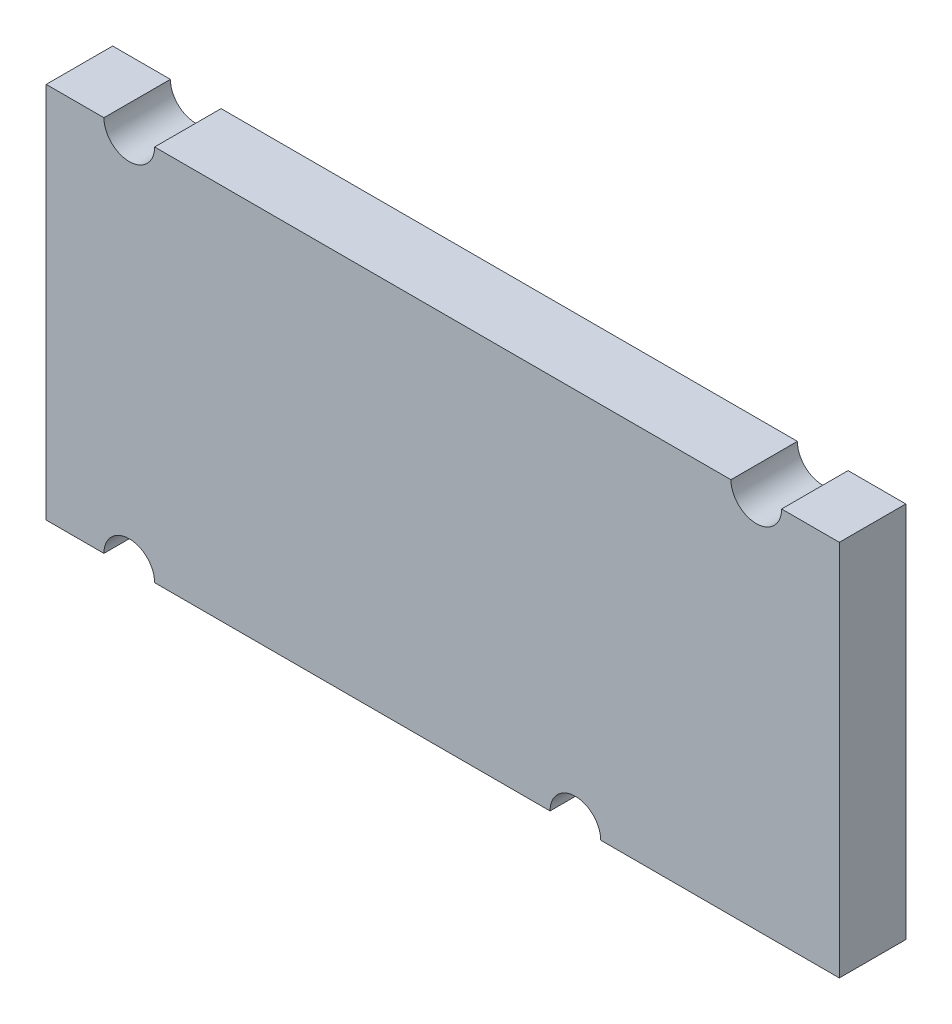
ISO-10303-21;
HEADER;
FILE_DESCRIPTION(('STEP AP214'),'2;1');
FILE_NAME('part.step','',(''),(''),'','','');
FILE_SCHEMA(('AUTOMOTIVE_DESIGN { 1 0 10303 214 1 1 1 1 }'));
ENDSEC;
DATA;
#1=APPLICATION_CONTEXT('core data for automotive mechanical design processes');
#2=APPLICATION_PROTOCOL_DEFINITION('international standard','automotive_design',2000,#1);
#3=PRODUCT_CONTEXT('',#1,'mechanical');
#4=PRODUCT('Part','Part','',(#3));
#5=PRODUCT_RELATED_PRODUCT_CATEGORY('part','',(#4));
#6=PRODUCT_DEFINITION_FORMATION('','',#4);
#7=PRODUCT_DEFINITION_CONTEXT('part definition',#1,'design');
#8=PRODUCT_DEFINITION('design','',#6,#7);
#9=PRODUCT_DEFINITION_SHAPE('','',#8);
#10=(LENGTH_UNIT() NAMED_UNIT(*) SI_UNIT(.MILLI.,.METRE.));
#11=(NAMED_UNIT(*) PLANE_ANGLE_UNIT() SI_UNIT($,.RADIAN.));
#12=(NAMED_UNIT(*) SI_UNIT($,.STERADIAN.) SOLID_ANGLE_UNIT());
#13=UNCERTAINTY_MEASURE_WITH_UNIT(LENGTH_MEASURE(1.E-05),#10,'distance_accuracy_value','');
#14=(GEOMETRIC_REPRESENTATION_CONTEXT(3) GLOBAL_UNCERTAINTY_ASSIGNED_CONTEXT((#13)) GLOBAL_UNIT_ASSIGNED_CONTEXT((#10,
#11,#12)) REPRESENTATION_CONTEXT('',''));
#15=CARTESIAN_POINT('',(0.,0.,0.));
#16=DIRECTION('',(0.,0.,1.));
#17=DIRECTION('',(1.,0.,0.));
#18=AXIS2_PLACEMENT_3D('',#15,#16,#17);
#19=CARTESIAN_POINT('',(11.7352503651986,-11.3549999999781,4.));
#20=DIRECTION('',(0.,0.,-1.));
#21=DIRECTION('',(-1.,0.,0.));
#22=AXIS2_PLACEMENT_3D('',#19,#20,#21);
#23=CYLINDRICAL_SURFACE('',#22,1.52499999999997);
#24=CARTESIAN_POINT('',(11.7352503651986,-11.3549999999781,0.));
#25=DIRECTION('',(0.,0.,1.));
#26=DIRECTION('',(1.,0.,0.));
#27=AXIS2_PLACEMENT_3D('',#24,#25,#26);
#28=CIRCLE('',#27,1.52499999999997);
#29=CARTESIAN_POINT('',(13.2602503651985,-11.3549999999781,0.));
#30=VERTEX_POINT('',#29);
#31=CARTESIAN_POINT('',(10.2102503651986,-11.3549999999781,0.));
#32=VERTEX_POINT('',#31);
#33=EDGE_CURVE('E157',#30,#32,#28,.T.);
#34=ORIENTED_EDGE('',*,*,#33,.F.);
#35=DIRECTION('',(0.,0.,-1.));
#36=VECTOR('',#35,1.);
#37=CARTESIAN_POINT('',(13.2602503651985,-11.3549999999781,4.));
#38=LINE('',#37,#36);
#39=CARTESIAN_POINT('',(13.2602503651985,-11.3549999999781,4.));
#40=VERTEX_POINT('',#39);
#41=EDGE_CURVE('E11',#40,#30,#38,.T.);
#42=ORIENTED_EDGE('',*,*,#41,.F.);
#43=CARTESIAN_POINT('',(11.7352503651986,-11.3549999999781,4.));
#44=DIRECTION('',(0.,0.,1.));
#45=DIRECTION('',(1.,0.,0.));
#46=AXIS2_PLACEMENT_3D('',#43,#44,#45);
#47=CIRCLE('',#46,1.52499999999997);
#48=CARTESIAN_POINT('',(10.2102503651986,-11.3549999999781,4.));
#49=VERTEX_POINT('',#48);
#50=EDGE_CURVE('E223',#40,#49,#47,.T.);
#51=ORIENTED_EDGE('',*,*,#50,.T.);
#52=DIRECTION('',(0.,0.,-1.));
#53=VECTOR('',#52,1.);
#54=CARTESIAN_POINT('',(10.2102503651986,-11.3549999999781,4.));
#55=LINE('',#54,#53);
#56=EDGE_CURVE('E99',#49,#32,#55,.T.);
#57=ORIENTED_EDGE('',*,*,#56,.T.);
#58=EDGE_LOOP('',(#34,#42,#51,#57));
#59=FACE_BOUND('',#58,.T.);
#60=ADVANCED_FACE('F37',(#59),#23,.F.);
#61=CARTESIAN_POINT('',(0.,-11.3549999999781,4.));
#62=DIRECTION('',(0.,1.,0.));
#63=DIRECTION('',(0.,0.,1.));
#64=AXIS2_PLACEMENT_3D('',#61,#62,#63);
#65=PLANE('',#64);
#66=DIRECTION('',(1.,0.,0.));
#67=VECTOR('',#66,1.);
#68=CARTESIAN_POINT('',(0.,-11.3549999999781,0.));
#69=LINE('',#68,#67);
#70=CARTESIAN_POINT('',(27.6218503651986,-11.3549999999781,0.));
#71=VERTEX_POINT('',#70);
#72=EDGE_CURVE('E160',#30,#71,#69,.T.);
#73=ORIENTED_EDGE('',*,*,#72,.T.);
#74=DIRECTION('',(0.,0.,-1.));
#75=VECTOR('',#74,1.);
#76=CARTESIAN_POINT('',(27.6218503651986,-11.3549999999781,4.));
#77=LINE('',#76,#75);
#78=CARTESIAN_POINT('',(27.6218503651986,-11.3549999999781,4.));
#79=VERTEX_POINT('',#78);
#80=EDGE_CURVE('E45',#79,#71,#77,.T.);
#81=ORIENTED_EDGE('',*,*,#80,.F.);
#82=DIRECTION('',(1.,0.,0.));
#83=VECTOR('',#82,1.);
#84=CARTESIAN_POINT('',(0.,-11.3549999999781,4.));
#85=LINE('',#84,#83);
#86=EDGE_CURVE('E141',#40,#79,#85,.T.);
#87=ORIENTED_EDGE('',*,*,#86,.F.);
#88=ORIENTED_EDGE('',*,*,#41,.T.);
#89=EDGE_LOOP('',(#73,#81,#87,#88));
#90=FACE_BOUND('',#89,.T.);
#91=ADVANCED_FACE('F205',(#90),#65,.F.);
#92=CARTESIAN_POINT('',(27.6218503651986,0.,4.));
#93=DIRECTION('',(1.,0.,0.));
#94=DIRECTION('',(0.,1.,0.));
#95=AXIS2_PLACEMENT_3D('',#92,#93,#94);
#96=PLANE('',#95);
#97=DIRECTION('',(0.,-1.,0.));
#98=VECTOR('',#97,1.);
#99=CARTESIAN_POINT('',(27.6218503651986,0.,0.));
#100=LINE('',#99,#98);
#101=CARTESIAN_POINT('',(27.6218503651986,11.3550000000219,0.));
#102=VERTEX_POINT('',#101);
#103=EDGE_CURVE('E163',#102,#71,#100,.T.);
#104=ORIENTED_EDGE('',*,*,#103,.F.);
#105=DIRECTION('',(0.,0.,-1.));
#106=VECTOR('',#105,1.);
#107=CARTESIAN_POINT('',(27.6218503651986,11.3550000000219,4.));
#108=LINE('',#107,#106);
#109=CARTESIAN_POINT('',(27.6218503651986,11.3550000000219,4.));
#110=VERTEX_POINT('',#109);
#111=EDGE_CURVE('E195',#110,#102,#108,.T.);
#112=ORIENTED_EDGE('',*,*,#111,.F.);
#113=DIRECTION('',(0.,-1.,0.));
#114=VECTOR('',#113,1.);
#115=CARTESIAN_POINT('',(27.6218503651986,0.,4.));
#116=LINE('',#115,#114);
#117=EDGE_CURVE('E202',#110,#79,#116,.T.);
#118=ORIENTED_EDGE('',*,*,#117,.T.);
#119=ORIENTED_EDGE('',*,*,#80,.T.);
#120=EDGE_LOOP('',(#104,#112,#118,#119));
#121=FACE_BOUND('',#120,.T.);
#122=ADVANCED_FACE('F200',(#121),#96,.T.);
#123=CARTESIAN_POINT('',(0.,11.3550000000219,4.));
#124=DIRECTION('',(0.,1.,0.));
#125=DIRECTION('',(0.,0.,1.));
#126=AXIS2_PLACEMENT_3D('',#123,#124,#125);
#127=PLANE('',#126);
#128=DIRECTION('',(1.,0.,0.));
#129=VECTOR('',#128,1.);
#130=CARTESIAN_POINT('',(0.,11.3550000000219,0.));
#131=LINE('',#130,#129);
#132=CARTESIAN_POINT('',(24.1468503651986,11.3550000000219,0.));
#133=VERTEX_POINT('',#132);
#134=EDGE_CURVE('E167',#133,#102,#131,.T.);
#135=ORIENTED_EDGE('',*,*,#134,.F.);
#136=DIRECTION('',(0.,0.,-1.));
#137=VECTOR('',#136,1.);
#138=CARTESIAN_POINT('',(24.1468503651986,11.3550000000219,4.));
#139=LINE('',#138,#137);
#140=CARTESIAN_POINT('',(24.1468503651986,11.3550000000219,4.));
#141=VERTEX_POINT('',#140);
#142=EDGE_CURVE('E193',#141,#133,#139,.T.);
#143=ORIENTED_EDGE('',*,*,#142,.F.);
#144=DIRECTION('',(1.,0.,0.));
#145=VECTOR('',#144,1.);
#146=CARTESIAN_POINT('',(0.,11.3550000000219,4.));
#147=LINE('',#146,#145);
#148=EDGE_CURVE('E215',#141,#110,#147,.T.);
#149=ORIENTED_EDGE('',*,*,#148,.T.);
#150=ORIENTED_EDGE('',*,*,#111,.T.);
#151=EDGE_LOOP('',(#135,#143,#149,#150));
#152=FACE_BOUND('',#151,.T.);
#153=ADVANCED_FACE('F212',(#152),#127,.T.);
#154=CARTESIAN_POINT('',(22.6218503651986,11.3550000000219,4.));
#155=DIRECTION('',(0.,0.,-1.));
#156=DIRECTION('',(-1.,0.,0.));
#157=AXIS2_PLACEMENT_3D('',#154,#155,#156);
#158=CYLINDRICAL_SURFACE('',#157,1.52499999999997);
#159=CARTESIAN_POINT('',(22.6218503651986,11.3550000000219,0.));
#160=DIRECTION('',(0.,0.,1.));
#161=DIRECTION('',(1.,0.,0.));
#162=AXIS2_PLACEMENT_3D('',#159,#160,#161);
#163=CIRCLE('',#162,1.52499999999997);
#164=CARTESIAN_POINT('',(21.0968503651986,11.3550000000219,0.));
#165=VERTEX_POINT('',#164);
#166=EDGE_CURVE('E170',#165,#133,#163,.T.);
#167=ORIENTED_EDGE('',*,*,#166,.F.);
#168=DIRECTION('',(0.,0.,-1.));
#169=VECTOR('',#168,1.);
#170=CARTESIAN_POINT('',(21.0968503651986,11.3550000000219,4.));
#171=LINE('',#170,#169);
#172=CARTESIAN_POINT('',(21.0968503651986,11.3550000000219,4.));
#173=VERTEX_POINT('',#172);
#174=EDGE_CURVE('E191',#173,#165,#171,.T.);
#175=ORIENTED_EDGE('',*,*,#174,.F.);
#176=CARTESIAN_POINT('',(22.6218503651986,11.3550000000219,4.));
#177=DIRECTION('',(0.,0.,1.));
#178=DIRECTION('',(1.,0.,0.));
#179=AXIS2_PLACEMENT_3D('',#176,#177,#178);
#180=CIRCLE('',#179,1.52499999999997);
#181=EDGE_CURVE('E219',#173,#141,#180,.T.);
#182=ORIENTED_EDGE('',*,*,#181,.T.);
#183=ORIENTED_EDGE('',*,*,#142,.T.);
#184=EDGE_LOOP('',(#167,#175,#182,#183));
#185=FACE_BOUND('',#184,.T.);
#186=ADVANCED_FACE('F237',(#185),#158,.F.);
#187=CARTESIAN_POINT('',(-13.5897496348014,11.3550000000219,0.));
#188=VERTEX_POINT('',#187);
#189=EDGE_CURVE('E172',#188,#165,#131,.T.);
#190=ORIENTED_EDGE('',*,*,#189,.F.);
#191=DIRECTION('',(0.,0.,-1.));
#192=VECTOR('',#191,1.);
#193=CARTESIAN_POINT('',(-13.5897496348014,11.3550000000219,4.));
#194=LINE('',#193,#192);
#195=CARTESIAN_POINT('',(-13.5897496348014,11.3550000000219,4.));
#196=VERTEX_POINT('',#195);
#197=EDGE_CURVE('E189',#196,#188,#194,.T.);
#198=ORIENTED_EDGE('',*,*,#197,.F.);
#199=EDGE_CURVE('E222',#196,#173,#147,.T.);
#200=ORIENTED_EDGE('',*,*,#199,.T.);
#201=ORIENTED_EDGE('',*,*,#174,.T.);
#202=EDGE_LOOP('',(#190,#198,#200,#201));
#203=FACE_BOUND('',#202,.T.);
#204=ADVANCED_FACE('F235',(#203),#127,.T.);
#205=CARTESIAN_POINT('',(-15.1147496348014,11.3550000000219,4.));
#206=DIRECTION('',(0.,0.,-1.));
#207=DIRECTION('',(-1.,0.,0.));
#208=AXIS2_PLACEMENT_3D('',#205,#206,#207);
#209=CYLINDRICAL_SURFACE('',#208,1.52499999999997);
#210=CARTESIAN_POINT('',(-15.1147496348014,11.3550000000219,0.));
#211=DIRECTION('',(0.,0.,1.));
#212=DIRECTION('',(1.,0.,0.));
#213=AXIS2_PLACEMENT_3D('',#210,#211,#212);
#214=CIRCLE('',#213,1.52499999999997);
#215=CARTESIAN_POINT('',(-16.6397496348014,11.3550000000219,0.));
#216=VERTEX_POINT('',#215);
#217=EDGE_CURVE('E175',#216,#188,#214,.T.);
#218=ORIENTED_EDGE('',*,*,#217,.F.);
#219=DIRECTION('',(0.,0.,-1.));
#220=VECTOR('',#219,1.);
#221=CARTESIAN_POINT('',(-16.6397496348014,11.3550000000219,4.));
#222=LINE('',#221,#220);
#223=CARTESIAN_POINT('',(-16.6397496348014,11.3550000000219,4.));
#224=VERTEX_POINT('',#223);
#225=EDGE_CURVE('E187',#224,#216,#222,.T.);
#226=ORIENTED_EDGE('',*,*,#225,.F.);
#227=CARTESIAN_POINT('',(-15.1147496348014,11.3550000000219,4.));
#228=DIRECTION('',(0.,0.,1.));
#229=DIRECTION('',(1.,0.,0.));
#230=AXIS2_PLACEMENT_3D('',#227,#228,#229);
#231=CIRCLE('',#230,1.52499999999997);
#232=EDGE_CURVE('E226',#224,#196,#231,.T.);
#233=ORIENTED_EDGE('',*,*,#232,.T.);
#234=ORIENTED_EDGE('',*,*,#197,.T.);
#235=EDGE_LOOP('',(#218,#226,#233,#234));
#236=FACE_BOUND('',#235,.T.);
#237=ADVANCED_FACE('F244',(#236),#209,.F.);
#238=CARTESIAN_POINT('',(-20.1147496348014,11.3550000000219,0.));
#239=VERTEX_POINT('',#238);
#240=EDGE_CURVE('E171',#239,#216,#131,.T.);
#241=ORIENTED_EDGE('',*,*,#240,.F.);
#242=DIRECTION('',(0.,0.,-1.));
#243=VECTOR('',#242,1.);
#244=CARTESIAN_POINT('',(-20.1147496348014,11.3550000000219,4.));
#245=LINE('',#244,#243);
#246=CARTESIAN_POINT('',(-20.1147496348014,11.3550000000219,4.));
#247=VERTEX_POINT('',#246);
#248=EDGE_CURVE('E185',#247,#239,#245,.T.);
#249=ORIENTED_EDGE('',*,*,#248,.F.);
#250=EDGE_CURVE('E221',#247,#224,#147,.T.);
#251=ORIENTED_EDGE('',*,*,#250,.T.);
#252=ORIENTED_EDGE('',*,*,#225,.T.);
#253=EDGE_LOOP('',(#241,#249,#251,#252));
#254=FACE_BOUND('',#253,.T.);
#255=ADVANCED_FACE('F243',(#254),#127,.T.);
#256=CARTESIAN_POINT('',(-20.1147496348014,0.,4.));
#257=DIRECTION('',(1.,0.,0.));
#258=DIRECTION('',(0.,1.,0.));
#259=AXIS2_PLACEMENT_3D('',#256,#257,#258);
#260=PLANE('',#259);
#261=DIRECTION('',(0.,-1.,0.));
#262=VECTOR('',#261,1.);
#263=CARTESIAN_POINT('',(-20.1147496348014,0.,0.));
#264=LINE('',#263,#262);
#265=CARTESIAN_POINT('',(-20.1147496348014,-11.3549999999781,0.));
#266=VERTEX_POINT('',#265);
#267=EDGE_CURVE('E178',#239,#266,#264,.T.);
#268=ORIENTED_EDGE('',*,*,#267,.T.);
#269=DIRECTION('',(0.,0.,-1.));
#270=VECTOR('',#269,1.);
#271=CARTESIAN_POINT('',(-20.1147496348014,-11.3549999999781,4.));
#272=LINE('',#271,#270);
#273=CARTESIAN_POINT('',(-20.1147496348014,-11.3549999999781,4.));
#274=VERTEX_POINT('',#273);
#275=EDGE_CURVE('E150',#274,#266,#272,.T.);
#276=ORIENTED_EDGE('',*,*,#275,.F.);
#277=DIRECTION('',(0.,-1.,0.));
#278=VECTOR('',#277,1.);
#279=CARTESIAN_POINT('',(-20.1147496348014,0.,4.));
#280=LINE('',#279,#278);
#281=EDGE_CURVE('E136',#247,#274,#280,.T.);
#282=ORIENTED_EDGE('',*,*,#281,.F.);
#283=ORIENTED_EDGE('',*,*,#248,.T.);
#284=EDGE_LOOP('',(#268,#276,#282,#283));
#285=FACE_BOUND('',#284,.T.);
#286=ADVANCED_FACE('F251',(#285),#260,.F.);
#287=CARTESIAN_POINT('',(-16.6397496348014,-11.3549999999781,0.));
#288=VERTEX_POINT('',#287);
#289=EDGE_CURVE('E146',#266,#288,#69,.T.);
#290=ORIENTED_EDGE('',*,*,#289,.T.);
#291=DIRECTION('',(0.,0.,-1.));
#292=VECTOR('',#291,1.);
#293=CARTESIAN_POINT('',(-16.6397496348014,-11.3549999999781,4.));
#294=LINE('',#293,#292);
#295=CARTESIAN_POINT('',(-16.6397496348014,-11.3549999999781,4.));
#296=VERTEX_POINT('',#295);
#297=EDGE_CURVE('E143',#296,#288,#294,.T.);
#298=ORIENTED_EDGE('',*,*,#297,.F.);
#299=EDGE_CURVE('E129',#274,#296,#85,.T.);
#300=ORIENTED_EDGE('',*,*,#299,.F.);
#301=ORIENTED_EDGE('',*,*,#275,.T.);
#302=EDGE_LOOP('',(#290,#298,#300,#301));
#303=FACE_BOUND('',#302,.T.);
#304=ADVANCED_FACE('F144',(#303),#65,.F.);
#305=CARTESIAN_POINT('',(-15.1147496348014,-11.3549999999781,4.));
#306=DIRECTION('',(0.,0.,-1.));
#307=DIRECTION('',(-1.,0.,0.));
#308=AXIS2_PLACEMENT_3D('',#305,#306,#307);
#309=CYLINDRICAL_SURFACE('',#308,1.52499999999997);
#310=CARTESIAN_POINT('',(-15.1147496348014,-11.3549999999781,0.));
#311=DIRECTION('',(0.,0.,1.));
#312=DIRECTION('',(1.,0.,0.));
#313=AXIS2_PLACEMENT_3D('',#310,#311,#312);
#314=CIRCLE('',#313,1.52499999999997);
#315=CARTESIAN_POINT('',(-13.5897496348014,-11.3549999999781,0.));
#316=VERTEX_POINT('',#315);
#317=EDGE_CURVE('E180',#316,#288,#314,.T.);
#318=ORIENTED_EDGE('',*,*,#317,.F.);
#319=DIRECTION('',(0.,0.,-1.));
#320=VECTOR('',#319,1.);
#321=CARTESIAN_POINT('',(-13.5897496348014,-11.3549999999781,4.));
#322=LINE('',#321,#320);
#323=CARTESIAN_POINT('',(-13.5897496348014,-11.3549999999781,4.));
#324=VERTEX_POINT('',#323);
#325=EDGE_CURVE('E92',#324,#316,#322,.T.);
#326=ORIENTED_EDGE('',*,*,#325,.F.);
#327=CARTESIAN_POINT('',(-15.1147496348014,-11.3549999999781,4.));
#328=DIRECTION('',(0.,0.,1.));
#329=DIRECTION('',(1.,0.,0.));
#330=AXIS2_PLACEMENT_3D('',#327,#328,#329);
#331=CIRCLE('',#330,1.52499999999997);
#332=EDGE_CURVE('E133',#324,#296,#331,.T.);
#333=ORIENTED_EDGE('',*,*,#332,.T.);
#334=ORIENTED_EDGE('',*,*,#297,.T.);
#335=EDGE_LOOP('',(#318,#326,#333,#334));
#336=FACE_BOUND('',#335,.T.);
#337=ADVANCED_FACE('F152',(#336),#309,.F.);
#338=EDGE_CURVE('E164',#316,#32,#69,.T.);
#339=ORIENTED_EDGE('',*,*,#338,.T.);
#340=ORIENTED_EDGE('',*,*,#56,.F.);
#341=EDGE_CURVE('E53',#324,#49,#85,.T.);
#342=ORIENTED_EDGE('',*,*,#341,.F.);
#343=ORIENTED_EDGE('',*,*,#325,.T.);
#344=EDGE_LOOP('',(#339,#340,#342,#343));
#345=FACE_BOUND('',#344,.T.);
#346=ADVANCED_FACE('F259',(#345),#65,.F.);
#347=CARTESIAN_POINT('',(0.,0.,4.));
#348=DIRECTION('',(0.,0.,1.));
#349=DIRECTION('',(1.,0.,0.));
#350=AXIS2_PLACEMENT_3D('',#347,#348,#349);
#351=PLANE('',#350);
#352=ORIENTED_EDGE('',*,*,#50,.F.);
#353=ORIENTED_EDGE('',*,*,#86,.T.);
#354=ORIENTED_EDGE('',*,*,#117,.F.);
#355=ORIENTED_EDGE('',*,*,#148,.F.);
#356=ORIENTED_EDGE('',*,*,#181,.F.);
#357=ORIENTED_EDGE('',*,*,#199,.F.);
#358=ORIENTED_EDGE('',*,*,#232,.F.);
#359=ORIENTED_EDGE('',*,*,#250,.F.);
#360=ORIENTED_EDGE('',*,*,#281,.T.);
#361=ORIENTED_EDGE('',*,*,#299,.T.);
#362=ORIENTED_EDGE('',*,*,#332,.F.);
#363=ORIENTED_EDGE('',*,*,#341,.T.);
#364=EDGE_LOOP('',(#352,#353,#354,#355,#356,#357,#358,#359,#360,#361,#362,#363));
#365=FACE_BOUND('',#364,.T.);
#366=ADVANCED_FACE('F131',(#365),#351,.T.);
#367=CARTESIAN_POINT('',(0.,0.,0.));
#368=DIRECTION('',(0.,0.,1.));
#369=DIRECTION('',(1.,0.,0.));
#370=AXIS2_PLACEMENT_3D('',#367,#368,#369);
#371=PLANE('',#370);
#372=ORIENTED_EDGE('',*,*,#33,.T.);
#373=ORIENTED_EDGE('',*,*,#338,.F.);
#374=ORIENTED_EDGE('',*,*,#317,.T.);
#375=ORIENTED_EDGE('',*,*,#289,.F.);
#376=ORIENTED_EDGE('',*,*,#267,.F.);
#377=ORIENTED_EDGE('',*,*,#240,.T.);
#378=ORIENTED_EDGE('',*,*,#217,.T.);
#379=ORIENTED_EDGE('',*,*,#189,.T.);
#380=ORIENTED_EDGE('',*,*,#166,.T.);
#381=ORIENTED_EDGE('',*,*,#134,.T.);
#382=ORIENTED_EDGE('',*,*,#103,.T.);
#383=ORIENTED_EDGE('',*,*,#72,.F.);
#384=EDGE_LOOP('',(#372,#373,#374,#375,#376,#377,#378,#379,#380,#381,#382,#383));
#385=FACE_BOUND('',#384,.T.);
#386=ADVANCED_FACE('F207',(#385),#371,.F.);
#387=CLOSED_SHELL('',(#60,#91,#122,#153,#186,#204,#237,#255,#286,#304,#337,#346,#366,#386));
#388=MANIFOLD_SOLID_BREP('B2',#387);
#389=ADVANCED_BREP_SHAPE_REPRESENTATION('',(#18,#388),#14);
#390=SHAPE_DEFINITION_REPRESENTATION(#9,#389);
ENDSEC;
END-ISO-10303-21;
